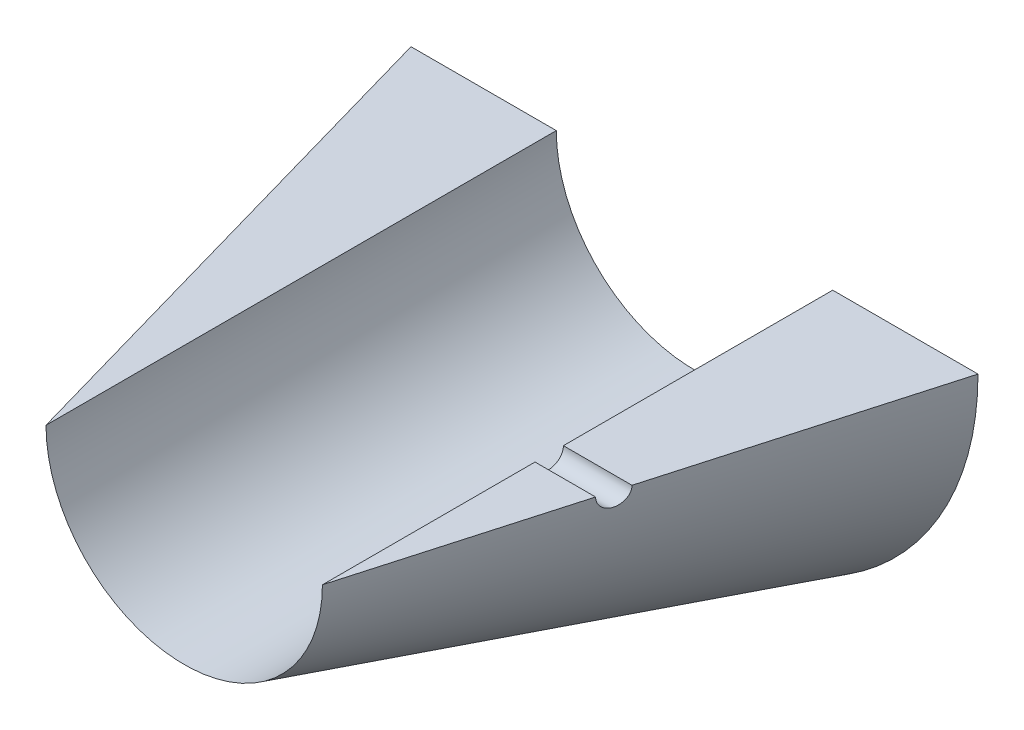
ISO-10303-21;
HEADER;
FILE_DESCRIPTION(('STEP AP214'),'2;1');
FILE_NAME('part.step','',(''),(''),'','','');
FILE_SCHEMA(('AUTOMOTIVE_DESIGN { 1 0 10303 214 1 1 1 1 }'));
ENDSEC;
DATA;
#1=APPLICATION_CONTEXT('core data for automotive mechanical design processes');
#2=APPLICATION_PROTOCOL_DEFINITION('international standard','automotive_design',2000,#1);
#3=PRODUCT_CONTEXT('',#1,'mechanical');
#4=PRODUCT('Part','Part','',(#3));
#5=PRODUCT_RELATED_PRODUCT_CATEGORY('part','',(#4));
#6=PRODUCT_DEFINITION_FORMATION('','',#4);
#7=PRODUCT_DEFINITION_CONTEXT('part definition',#1,'design');
#8=PRODUCT_DEFINITION('design','',#6,#7);
#9=PRODUCT_DEFINITION_SHAPE('','',#8);
#10=(LENGTH_UNIT() NAMED_UNIT(*) SI_UNIT(.MILLI.,.METRE.));
#11=(NAMED_UNIT(*) PLANE_ANGLE_UNIT() SI_UNIT($,.RADIAN.));
#12=(NAMED_UNIT(*) SI_UNIT($,.STERADIAN.) SOLID_ANGLE_UNIT());
#13=UNCERTAINTY_MEASURE_WITH_UNIT(LENGTH_MEASURE(1.E-05),#10,'distance_accuracy_value','');
#14=(GEOMETRIC_REPRESENTATION_CONTEXT(3) GLOBAL_UNCERTAINTY_ASSIGNED_CONTEXT((#13)) GLOBAL_UNIT_ASSIGNED_CONTEXT((#10,
#11,#12)) REPRESENTATION_CONTEXT('',''));
#15=CARTESIAN_POINT('',(0.,0.,0.));
#16=DIRECTION('',(0.,0.,1.));
#17=DIRECTION('',(1.,0.,0.));
#18=AXIS2_PLACEMENT_3D('',#15,#16,#17);
#19=CARTESIAN_POINT('',(0.,0.,180.));
#20=DIRECTION('',(0.,0.,1.));
#21=DIRECTION('',(1.,0.,0.));
#22=AXIS2_PLACEMENT_3D('',#19,#20,#21);
#23=CYLINDRICAL_SURFACE('',#22,48.75);
#24=DIRECTION('',(0.,0.,1.));
#25=VECTOR('',#24,1.);
#26=CARTESIAN_POINT('',(-48.75,0.,180.));
#27=LINE('',#26,#25);
#28=CARTESIAN_POINT('',(-48.75,0.,180.));
#29=VERTEX_POINT('',#28);
#30=CARTESIAN_POINT('',(-48.75,0.,0.));
#31=VERTEX_POINT('',#30);
#32=EDGE_CURVE('E49',#29,#31,#27,.F.);
#33=ORIENTED_EDGE('',*,*,#32,.F.);
#34=CARTESIAN_POINT('',(0.,0.,180.));
#35=DIRECTION('',(0.,0.,1.));
#36=DIRECTION('',(1.,0.,0.));
#37=AXIS2_PLACEMENT_3D('',#34,#35,#36);
#38=CIRCLE('',#37,48.75);
#39=CARTESIAN_POINT('',(48.75,0.,180.));
#40=VERTEX_POINT('',#39);
#41=EDGE_CURVE('E95',#29,#40,#38,.T.);
#42=ORIENTED_EDGE('',*,*,#41,.T.);
#43=DIRECTION('',(0.,0.,1.));
#44=VECTOR('',#43,1.);
#45=CARTESIAN_POINT('',(48.75,0.,180.));
#46=LINE('',#45,#44);
#47=CARTESIAN_POINT('',(48.75,0.,105.));
#48=VERTEX_POINT('',#47);
#49=EDGE_CURVE('E84',#48,#40,#46,.T.);
#50=ORIENTED_EDGE('',*,*,#49,.F.);
#51=CARTESIAN_POINT('',(48.75,0.,95.));
#52=CARTESIAN_POINT('',(48.750000389197,-0.14008100086284,94.9999986018309));
#53=CARTESIAN_POINT('',(48.7493950083053,-0.280140737873493,95.0058890159541));
#54=CARTESIAN_POINT('',(48.7469912287984,-0.559305925529234,95.0294068089419));
#55=CARTESIAN_POINT('',(48.7451925455075,-0.698411140459885,95.0470369884638));
#56=CARTESIAN_POINT('',(48.7404503592909,-0.974737830645201,95.0939279402502));
#57=CARTESIAN_POINT('',(48.737505949223,-1.11195772382351,95.1231979288691));
#58=CARTESIAN_POINT('',(48.7305544431504,-1.38347878134987,95.1931665631875));
#59=CARTESIAN_POINT('',(48.7265469582316,-1.51777885802131,95.2338693917857));
#60=CARTESIAN_POINT('',(48.7175873522136,-1.7823254585363,95.3263577551216));
#61=CARTESIAN_POINT('',(48.7126361631751,-1.91257583570178,95.3781323607879));
#62=CARTESIAN_POINT('',(48.701923936988,-2.16829177987035,95.4924361395613));
#63=CARTESIAN_POINT('',(48.696162601784,-2.2937555641763,95.5549692726647));
#64=CARTESIAN_POINT('',(48.6839968800058,-2.5388978794622,95.6902913994103));
#65=CARTESIAN_POINT('',(48.6775928619544,-2.65857966824321,95.7630745251197));
#66=CARTESIAN_POINT('',(48.6643161559048,-2.89144274282538,95.9184369559612));
#67=CARTESIAN_POINT('',(48.6574432951223,-3.00462160346189,96.0010198810297));
#68=CARTESIAN_POINT('',(48.6434027571373,-3.22397034323184,96.1756405164407));
#69=CARTESIAN_POINT('',(48.6362342596262,-3.33011824606443,96.2677057671708));
#70=CARTESIAN_POINT('',(48.6218213751467,-3.53432740876358,96.4604728753795));
#71=CARTESIAN_POINT('',(48.614576961105,-3.63238566486568,96.5611779128343));
#72=CARTESIAN_POINT('',(48.600221908122,-3.8196530425597,96.7704550377934));
#73=CARTESIAN_POINT('',(48.5931112269238,-3.90886499881192,96.8790245858134));
#74=CARTESIAN_POINT('',(48.5792198977998,-4.07787800390798,97.1033399806117));
#75=CARTESIAN_POINT('',(48.5724393726231,-4.15767556801212,97.219088460637));
#76=CARTESIAN_POINT('',(48.5593915128267,-4.30739554051586,97.4571373901257));
#77=CARTESIAN_POINT('',(48.55312516295,-4.37729917752714,97.5794497025295));
#78=CARTESIAN_POINT('',(48.5412967585839,-4.50657563732373,97.8296061375659));
#79=CARTESIAN_POINT('',(48.5357349658752,-4.56594454916064,97.9574522927828));
#80=CARTESIAN_POINT('',(48.5254804614672,-4.67366907148744,98.217689519941));
#81=CARTESIAN_POINT('',(48.5207874115692,-4.7220289694427,98.3500787993653));
#82=CARTESIAN_POINT('',(48.5124001208882,-4.80742627588238,98.6185052355794));
#83=CARTESIAN_POINT('',(48.5087062478272,-4.84445951652841,98.7545437151754));
#84=CARTESIAN_POINT('',(48.4993223283529,-4.93785036616057,99.1656124433031));
#85=CARTESIAN_POINT('',(48.4952805494567,-4.97700104155831,99.4448123428154));
#86=CARTESIAN_POINT('',(48.4920997750474,-5.00789044245951,100.005695122123));
#87=CARTESIAN_POINT('',(48.4929606443874,-4.99963047488887,100.287377933261));
#88=CARTESIAN_POINT('',(48.4994651170514,-4.9361304439657,100.84428299938));
#89=CARTESIAN_POINT('',(48.5050904528067,-4.88106981740609,101.119525809727));
#90=CARTESIAN_POINT('',(48.5204637315776,-4.72579415216424,101.65683235715));
#91=CARTESIAN_POINT('',(48.5302117328848,-4.62557847502081,101.918895907822));
#92=CARTESIAN_POINT('',(48.5527523909515,-4.38264425232442,102.422984278809));
#93=CARTESIAN_POINT('',(48.5655507320491,-4.23984622785899,102.664970536143));
#94=CARTESIAN_POINT('',(48.5927454108909,-3.91585672545949,103.12160957111));
#95=CARTESIAN_POINT('',(48.6071417978411,-3.73466406514936,103.336261506646));
#96=CARTESIAN_POINT('',(48.6359918294384,-3.3380272417351,103.733182554229));
#97=CARTESIAN_POINT('',(48.6504454299169,-3.12242809707303,103.915296835475));
#98=CARTESIAN_POINT('',(48.6777183357708,-2.66363602583515,104.24077219106));
#99=CARTESIAN_POINT('',(48.6905376391663,-2.42044306583126,104.384133218452));
#100=CARTESIAN_POINT('',(48.7131020876591,-1.91325834758283,104.628027014304));
#101=CARTESIAN_POINT('',(48.7228466565943,-1.64926270277589,104.728551757082));
#102=CARTESIAN_POINT('',(48.7381578744169,-1.10801780887595,104.883805091289));
#103=CARTESIAN_POINT('',(48.7437246547517,-0.830768977065377,104.938535123583));
#104=CARTESIAN_POINT('',(48.7500361632012,-0.272228441535443,105.00044864221));
#105=CARTESIAN_POINT('',(48.7508025560036,0.00903934777978221,105.007845750611));
#106=CARTESIAN_POINT('',(48.7474850668982,0.568810634624786,104.975444758929));
#107=CARTESIAN_POINT('',(48.7434012539818,0.847314171417597,104.93564733016));
#108=CARTESIAN_POINT('',(48.7308560801636,1.39303341447142,104.81016423428));
#109=CARTESIAN_POINT('',(48.7224042785875,1.66027239745354,104.724578759789));
#110=CARTESIAN_POINT('',(48.7020711161284,2.17660055900645,104.510052035007));
#111=CARTESIAN_POINT('',(48.6901896745848,2.42568931053593,104.381109765012));
#112=CARTESIAN_POINT('',(48.6642718407333,2.8996110877734,104.083001330848));
#113=CARTESIAN_POINT('',(48.6502280017268,3.12435554042963,103.913695015106));
#114=CARTESIAN_POINT('',(48.621584691777,3.54231194552546,103.539864177106));
#115=CARTESIAN_POINT('',(48.606985206158,3.73552306438865,103.335338724132));
#116=CARTESIAN_POINT('',(48.5788106240481,4.08567185517549,102.895946149536));
#117=CARTESIAN_POINT('',(48.5652396221104,4.24246919531283,102.660966909692));
#118=CARTESIAN_POINT('',(48.5407216552142,4.51437295777038,102.167875136452));
#119=CARTESIAN_POINT('',(48.5297746527683,4.62947997570706,101.909762933614));
#120=CARTESIAN_POINT('',(48.511768592767,4.8145067034086,101.378263175584));
#121=CARTESIAN_POINT('',(48.5047023901735,4.88450949714478,101.104904720184));
#122=CARTESIAN_POINT('',(48.4952408395981,4.97759035860086,100.550083631075));
#123=CARTESIAN_POINT('',(48.4928453500628,5.00066984840871,100.268621243232));
#124=CARTESIAN_POINT('',(48.4929473956605,4.99964290141229,99.8474570227359));
#125=CARTESIAN_POINT('',(48.4935928392565,4.99340252271699,99.7074908372863));
#126=CARTESIAN_POINT('',(48.4960784705341,4.96921054801502,99.4285989653847));
#127=CARTESIAN_POINT('',(48.4979182145855,4.95126330058479,99.2896729119443));
#128=CARTESIAN_POINT('',(48.5027427204151,4.90377491789048,99.0137948239799));
#129=CARTESIAN_POINT('',(48.5057279015383,4.87422953645153,98.8768435314916));
#130=CARTESIAN_POINT('',(48.5127559314431,4.80377618536093,98.6059744620394));
#131=CARTESIAN_POINT('',(48.5167983936194,4.76287236869493,98.4720555956482));
#132=CARTESIAN_POINT('',(48.525827445254,4.66998352416419,98.2081206581476));
#133=CARTESIAN_POINT('',(48.5308142285033,4.6179962215002,98.0781053944811));
#134=CARTESIAN_POINT('',(48.5415877348515,4.50334014269483,97.8229651191824));
#135=CARTESIAN_POINT('',(48.5473741657096,4.4406752668614,97.6978383423255));
#136=CARTESIAN_POINT('',(48.5595869146512,4.30507283476307,97.453255580476));
#137=CARTESIAN_POINT('',(48.5660134594491,4.23213163503253,97.3338016269521));
#138=CARTESIAN_POINT('',(48.5793210747985,4.0765372254649,97.1014861820133));
#139=CARTESIAN_POINT('',(48.5862019798918,3.99388754258636,96.9886223186799));
#140=CARTESIAN_POINT('',(48.6002611013155,3.8190116579077,96.7696946920308));
#141=CARTESIAN_POINT('',(48.6074405953638,3.72674104488739,96.6636664823935));
#142=CARTESIAN_POINT('',(48.6218597096454,3.5336420168319,96.4597909416014));
#143=CARTESIAN_POINT('',(48.6290993069958,3.4328167350974,96.3619406409847));
#144=CARTESIAN_POINT('',(48.6434412404114,3.22322228659948,96.1750073996124));
#145=CARTESIAN_POINT('',(48.650543490368,3.1144483284338,96.0859298242102));
#146=CARTESIAN_POINT('',(48.6644030484974,2.88981516863571,95.9172695742775));
#147=CARTESIAN_POINT('',(48.6711604830766,2.77395859816484,95.8376834057625));
#148=CARTESIAN_POINT('',(48.6841620584364,2.53557744063651,95.6883076711548));
#149=CARTESIAN_POINT('',(48.6904045927547,2.41303383009732,95.6185483180658));
#150=CARTESIAN_POINT('',(48.7021740092982,2.16251348650119,95.4896370889704));
#151=CARTESIAN_POINT('',(48.7077011534379,2.03453876476771,95.4304813277677));
#152=CARTESIAN_POINT('',(48.7178810869501,1.77412573229979,95.3232180732733));
#153=CARTESIAN_POINT('',(48.7225345887302,1.64169116318527,95.275101570895));
#154=CARTESIAN_POINT('',(48.7308395507551,1.37324976919271,95.1902179849387));
#155=CARTESIAN_POINT('',(48.734491256199,1.23724382738741,95.1534481238882));
#156=CARTESIAN_POINT('',(48.7416578208933,0.919647422003384,95.0818324431433));
#157=CARTESIAN_POINT('',(48.7447736658721,0.737087728326719,95.0511749660776));
#158=CARTESIAN_POINT('',(48.7489444941515,0.36967301153783,95.0102597116689));
#159=CARTESIAN_POINT('',(48.749999486507,0.184817998514194,95.0000018446957));
#160=CARTESIAN_POINT('',(48.75,0.,95.));
#161=B_SPLINE_CURVE_WITH_KNOTS('',3,(#51,#52,#53,#54,#55,#56,#57,#58,#59,#60,#61,#62,#63,#64,
#65,#66,#67,#68,#69,#70,#71,#72,#73,#74,#75,#76,#77,#78,#79,#80,#81,#82,#83,#84,#85,#86,#87,#88,
#89,#90,#91,#92,#93,#94,#95,#96,#97,#98,#99,#100,#101,#102,#103,#104,#105,#106,#107,#108,#109,
#110,#111,#112,#113,#114,#115,#116,#117,#118,#119,#120,#121,#122,#123,#124,#125,#126,#127,#128,
#129,#130,#131,#132,#133,#134,#135,#136,#137,#138,#139,#140,#141,#142,#143,#144,#145,#146,#147,
#148,#149,#150,#151,#152,#153,#154,#155,#156,#157,#158,#159,#160),.UNSPECIFIED.,.T.,.F.,(4,2,2,
2,2,2,2,2,2,2,2,2,2,2,2,2,2,2,2,2,2,2,2,2,2,2,2,2,2,2,2,2,2,2,2,2,2,2,2,2,2,2,2,2,2,2,2,2,2,2,2,
2,2,2,4),(0.,0.420081372263408,0.840262995736704,1.26077798189679,1.68144702145216,
2.1017027151597,2.52211342872985,2.9422844359281,3.36261113558632,3.78419502857095,
4.20593476173172,4.62753891521351,5.04929863919035,5.47184812352873,5.89455414991491,
6.31709527054133,6.7397916859001,7.58128440501172,8.42275392757352,9.26101167859738,
10.0992812823782,10.939125394758,11.7789953741871,12.62276120516,13.4665280583104,
14.3104529277644,15.1543512433517,15.9944381904937,16.8345131880398,17.6727574216204,
18.5110213711709,19.352239444942,20.1934797525183,21.0379101468124,21.8823284765202,
22.7251868695829,23.5680197180541,23.9879313067028,24.4076870057928,24.8275965245294,
25.2473527134102,25.6671951370627,26.086884528002,26.5067230958436,26.92640961108,
27.3481272649718,27.7696911185456,28.1915112178113,28.6131755538511,29.0361092707313,
29.458887704913,29.8813198745028,30.3036485574235,30.8578917387347,31.4121324848502),.UNSPECIFIED.);
#162=CARTESIAN_POINT('',(48.75,0.,95.));
#163=VERTEX_POINT('',#162);
#164=EDGE_CURVE('E94',#163,#48,#161,.T.);
#165=ORIENTED_EDGE('',*,*,#164,.F.);
#166=CARTESIAN_POINT('',(48.75,0.,0.));
#167=VERTEX_POINT('',#166);
#168=EDGE_CURVE('E98',#167,#163,#46,.T.);
#169=ORIENTED_EDGE('',*,*,#168,.F.);
#170=CARTESIAN_POINT('',(0.,0.,0.));
#171=DIRECTION('',(0.,0.,1.));
#172=DIRECTION('',(1.,0.,0.));
#173=AXIS2_PLACEMENT_3D('',#170,#171,#172);
#174=CIRCLE('',#173,48.75);
#175=EDGE_CURVE('E91',#31,#167,#174,.T.);
#176=ORIENTED_EDGE('',*,*,#175,.F.);
#177=EDGE_LOOP('',(#33,#42,#50,#165,#169,#176));
#178=FACE_BOUND('',#177,.T.);
#179=ADVANCED_FACE('F34',(#178),#23,.F.);
#180=CARTESIAN_POINT('',(0.,0.,0.));
#181=DIRECTION('',(0.,0.,-1.));
#182=DIRECTION('',(-1.,0.,0.));
#183=AXIS2_PLACEMENT_3D('',#180,#181,#182);
#184=CONICAL_SURFACE('',#183,100.,0.277382228069845);
#185=DIRECTION('',(0.273838880592993,0.,-0.961775580619292));
#186=VECTOR('',#185,1.);
#187=CARTESIAN_POINT('',(0.,0.,351.219512195122));
#188=LINE('',#187,#186);
#189=CARTESIAN_POINT('',(70.1041666666667,0.,105.));
#190=VERTEX_POINT('',#189);
#191=EDGE_CURVE('E86',#40,#190,#188,.T.);
#192=ORIENTED_EDGE('',*,*,#191,.F.);
#193=ORIENTED_EDGE('',*,*,#41,.F.);
#194=DIRECTION('',(0.273838880592993,0.,0.961775580619292));
#195=VECTOR('',#194,1.);
#196=CARTESIAN_POINT('',(0.,0.,351.219512195122));
#197=LINE('',#196,#195);
#198=CARTESIAN_POINT('',(-100.,0.,0.));
#199=VERTEX_POINT('',#198);
#200=EDGE_CURVE('E176',#199,#29,#197,.T.);
#201=ORIENTED_EDGE('',*,*,#200,.F.);
#202=CARTESIAN_POINT('',(0.,0.,0.));
#203=DIRECTION('',(0.,0.,1.));
#204=DIRECTION('',(1.,0.,0.));
#205=AXIS2_PLACEMENT_3D('',#202,#203,#204);
#206=CIRCLE('',#205,100.);
#207=CARTESIAN_POINT('',(100.,0.,0.));
#208=VERTEX_POINT('',#207);
#209=EDGE_CURVE('E102',#199,#208,#206,.T.);
#210=ORIENTED_EDGE('',*,*,#209,.T.);
#211=CARTESIAN_POINT('',(72.9513888888889,0.,95.));
#212=VERTEX_POINT('',#211);
#213=EDGE_CURVE('E96',#212,#208,#188,.T.);
#214=ORIENTED_EDGE('',*,*,#213,.F.);
#215=CARTESIAN_POINT('',(72.3344104427794,-3.8482549831851,96.8076758302407));
#216=CARTESIAN_POINT('',(72.297342251452,-3.94164834775744,96.9202568766703));
#217=CARTESIAN_POINT('',(72.2592485186354,-4.02992428732077,97.0367301921056));
#218=CARTESIAN_POINT('',(72.1813937055541,-4.19576304657064,97.276612803554));
#219=CARTESIAN_POINT('',(72.1416320206225,-4.27332193658131,97.4000246205307));
#220=CARTESIAN_POINT('',(72.0607983532004,-4.41732391511411,97.6529889511765));
#221=CARTESIAN_POINT('',(72.0197247208557,-4.48375229382683,97.7825493050856));
#222=CARTESIAN_POINT('',(71.9366874751427,-4.60500455194623,98.0467794058756));
#223=CARTESIAN_POINT('',(71.8947235293899,-4.65982401038557,98.1814510763332));
#224=CARTESIAN_POINT('',(71.8103686893135,-4.75741279563863,98.4546745202502));
#225=CARTESIAN_POINT('',(71.7679786631524,-4.80020288690188,98.5932191480942));
#226=CARTESIAN_POINT('',(71.6830425703146,-4.87360389722578,98.8735097834928));
#227=CARTESIAN_POINT('',(71.6404964522715,-4.90421035942921,99.0152569425555));
#228=CARTESIAN_POINT('',(71.5556370878055,-4.95299191296492,99.3008299442789));
#229=CARTESIAN_POINT('',(71.5133236962707,-4.9711759029638,99.4446542234488));
#230=CARTESIAN_POINT('',(71.4292093060449,-4.99499909619713,99.7335453817654));
#231=CARTESIAN_POINT('',(71.387408501737,-5.00063367835389,99.8786126989048));
#232=CARTESIAN_POINT('',(71.3042269420228,-4.99924637095836,100.170388479454));
#233=CARTESIAN_POINT('',(71.2628546359705,-4.992096655218,100.317098778275));
#234=CARTESIAN_POINT('',(71.1812464410978,-4.96486342249668,100.609694625701));
#235=CARTESIAN_POINT('',(71.1410109865828,-4.94477503053317,100.755579842526));
#236=CARTESIAN_POINT('',(71.0619837935183,-4.89172362367754,101.045334988883));
#237=CARTESIAN_POINT('',(71.0231915682464,-4.8587649931224,101.189205587439));
#238=CARTESIAN_POINT('',(70.947277692855,-4.78009873162702,101.473932805163));
#239=CARTESIAN_POINT('',(70.9101566502287,-4.73438650738603,101.61478831871));
#240=CARTESIAN_POINT('',(70.8384761022673,-4.63137776491862,101.889846695489));
#241=CARTESIAN_POINT('',(70.8038827712761,-4.57430184242394,102.024123336298));
#242=CARTESIAN_POINT('',(70.7367302857903,-4.44837775500767,102.287634180933));
#243=CARTESIAN_POINT('',(70.704171893865,-4.37952521262545,102.416866487723));
#244=CARTESIAN_POINT('',(70.6412911699547,-4.23050637862678,102.669129581625));
#245=CARTESIAN_POINT('',(70.6109676873387,-4.15034597163186,102.792163549445));
#246=CARTESIAN_POINT('',(70.5526844415869,-3.97921673684608,103.03108384329));
#247=CARTESIAN_POINT('',(70.5247255285609,-3.88824404986076,103.146967594655));
#248=CARTESIAN_POINT('',(70.4463246807372,-3.60618889102909,103.475137337748));
#249=CARTESIAN_POINT('',(70.3992715685781,-3.40095937748356,103.676379857686));
#250=CARTESIAN_POINT('',(70.3152489826932,-2.95793863259964,104.041418796466));
#251=CARTESIAN_POINT('',(70.2782778142858,-2.72015288376901,104.205221507845));
#252=CARTESIAN_POINT('',(70.2156906935521,-2.22606132138278,104.485867905413));
#253=CARTESIAN_POINT('',(70.1897795202408,-1.97048212587851,104.603923494281));
#254=CARTESIAN_POINT('',(70.1480137800488,-1.44242448422665,104.79565460646));
#255=CARTESIAN_POINT('',(70.1321581387436,-1.16994784697188,104.869334871193));
#256=CARTESIAN_POINT('',(70.1107724199298,-0.620951937919615,104.968993329965));
#257=CARTESIAN_POINT('',(70.1050667858289,-0.344586462373336,104.99578242953));
#258=CARTESIAN_POINT('',(70.1034633176426,0.208791351094806,105.003295512395));
#259=CARTESIAN_POINT('',(70.1075649725617,0.485803654563269,104.984021895731));
#260=CARTESIAN_POINT('',(70.1255044005828,1.03086087074179,104.900295553295));
#261=CARTESIAN_POINT('',(70.1392831859912,1.29894985896373,104.836116560533));
#262=CARTESIAN_POINT('',(70.1764456852173,1.82036799223322,104.66492844216));
#263=CARTESIAN_POINT('',(70.1998293738459,2.07369717598666,104.557919428872));
#264=CARTESIAN_POINT('',(70.2561653777087,2.55966339954795,104.303907197622));
#265=CARTESIAN_POINT('',(70.2891583118976,2.792207008001,104.156734374332));
#266=CARTESIAN_POINT('',(70.3643648313081,3.22914860438056,103.827204289685));
#267=CARTESIAN_POINT('',(70.4065788842213,3.43354516384165,103.644845243749));
#268=CARTESIAN_POINT('',(70.5004157936502,3.81182877766303,103.247510889298));
#269=CARTESIAN_POINT('',(70.5521704768207,3.98521133255176,103.03208672501));
#270=CARTESIAN_POINT('',(70.6638498019861,4.29345353044594,102.577165283322));
#271=CARTESIAN_POINT('',(70.7237753724772,4.42830879001568,102.337665270883));
#272=CARTESIAN_POINT('',(70.8523506862158,4.65953164181777,101.83500842853));
#273=CARTESIAN_POINT('',(70.9211859909914,4.75481352533009,101.571399938312));
#274=CARTESIAN_POINT('',(71.0648159578709,4.89994500487304,101.033525729819));
#275=CARTESIAN_POINT('',(71.1396116046294,4.94978707721087,100.75925825452));
#276=CARTESIAN_POINT('',(71.2958190777194,5.00423327379883,100.19863306801));
#277=CARTESIAN_POINT('',(71.3773656343697,5.00734915348368,99.912168157482));
#278=CARTESIAN_POINT('',(71.5426357939453,4.9649099906913,99.343488122812));
#279=CARTESIAN_POINT('',(71.6263597632022,4.91934670598766,99.0612737265612));
#280=CARTESIAN_POINT('',(71.7954661466697,4.77920742264671,98.5019057464639));
#281=CARTESIAN_POINT('',(71.8808399239317,4.68347711951628,98.2250378664362));
#282=CARTESIAN_POINT('',(72.0482373003637,4.44472929045425,97.6913549367887));
#283=CARTESIAN_POINT('',(72.1302606854711,4.30170874835853,97.4345411675088));
#284=CARTESIAN_POINT('',(72.2875963830451,3.97210775773648,96.9490577729941));
#285=CARTESIAN_POINT('',(72.3629227095252,3.78562137653766,96.7203289765303));
#286=CARTESIAN_POINT('',(72.5037551994354,3.37347508582064,96.2977416438105));
#287=CARTESIAN_POINT('',(72.5692632397583,3.14782268124088,96.1038764415058));
#288=CARTESIAN_POINT('',(72.6850324786803,2.67234662196699,95.7643495157037));
#289=CARTESIAN_POINT('',(72.7357667381791,2.42372076071589,95.6171741957666));
#290=CARTESIAN_POINT('',(72.8224607644825,1.90272003148597,95.3671777334845));
#291=CARTESIAN_POINT('',(72.8584261098979,1.63035417794592,95.2643398429817));
#292=CARTESIAN_POINT('',(72.9120414557822,1.08552523628,95.1115111935793));
#293=CARTESIAN_POINT('',(72.930578019778,0.81386655563779,95.0589595945602));
#294=CARTESIAN_POINT('',(72.9515909053043,0.265023056148882,94.9994108992838));
#295=CARTESIAN_POINT('',(72.9540719831561,-0.0121601017015707,94.9924003118296));
#296=CARTESIAN_POINT('',(72.9430509861399,-0.553556804829854,95.0236094834158));
#297=CARTESIAN_POINT('',(72.9301219187618,-0.817877659292037,95.0602076883691));
#298=CARTESIAN_POINT('',(72.8898928438587,-1.33636548708416,95.1745869136293));
#299=CARTESIAN_POINT('',(72.8625893136336,-1.59052995498896,95.2523780289684));
#300=CARTESIAN_POINT('',(72.7947522728482,-2.08333789019387,95.4469392920846));
#301=CARTESIAN_POINT('',(72.7541385957174,-2.32187652895016,95.5639457317503));
#302=CARTESIAN_POINT('',(72.6616149772138,-2.77568928984393,95.8328674808929));
#303=CARTESIAN_POINT('',(72.6097163611319,-2.99098641475167,95.984747800284));
#304=CARTESIAN_POINT('',(72.5197171840105,-3.31197336959616,96.2509866205535));
#305=CARTESIAN_POINT('',(72.484543458109,-3.42673458962763,96.3556220919958));
#306=CARTESIAN_POINT('',(72.4114298764104,-3.64564464849038,96.5746217655433));
#307=CARTESIAN_POINT('',(72.373490089851,-3.7497937527985,96.6889857241456));
#308=CARTESIAN_POINT('',(72.3344104427794,-3.8482549831851,96.8076758302407));
#309=B_SPLINE_CURVE_WITH_KNOTS('',3,(#215,#216,#217,#218,#219,#220,#221,#222,#223,#224,#225,
#226,#227,#228,#229,#230,#231,#232,#233,#234,#235,#236,#237,#238,#239,#240,#241,#242,#243,#244,
#245,#246,#247,#248,#249,#250,#251,#252,#253,#254,#255,#256,#257,#258,#259,#260,#261,#262,#263,
#264,#265,#266,#267,#268,#269,#270,#271,#272,#273,#274,#275,#276,#277,#278,#279,#280,#281,#282,
#283,#284,#285,#286,#287,#288,#289,#290,#291,#292,#293,#294,#295,#296,#297,#298,#299,#300,#301,
#302,#303,#304,#305,#306,#307,#308),.UNSPECIFIED.,.T.,.F.,(4,2,2,2,2,2,2,2,2,2,2,2,2,2,2,2,2,2,
2,2,2,2,2,2,2,2,2,2,2,2,2,2,2,2,2,2,2,2,2,2,2,2,2,2,2,2,4),(0.,0.452544553034413,
0.905254605063821,1.3585583076147,1.81203433034364,2.26472271223476,2.71757653888203,
3.17010562882543,3.62280132635735,4.08004872639717,4.53746850713826,4.99473260036979,
5.4521615937023,5.9014514034823,6.3509085821425,6.80013271993697,7.24951768220831,
8.1185955546342,8.98752725293938,9.83154140186433,10.6754653534424,11.504645249808,
12.3337819438143,13.1579079489118,13.9820317927357,14.809691119259,15.6373924341043,
16.4775288660685,17.3177608463641,18.1797255612834,19.0418329700292,19.9313424917245,
20.8210026466742,21.7320952823478,22.6432460385807,23.5524429274398,24.4614657892172,
25.3369763577453,26.212155917824,27.0399295745708,27.8674579981418,28.6651519668998,
29.4630415148386,30.2658278661165,31.0678122486272,31.5449254641643,32.0220267411186),.UNSPECIFIED.);
#310=EDGE_CURVE('E100',#212,#190,#309,.T.);
#311=ORIENTED_EDGE('',*,*,#310,.T.);
#312=EDGE_LOOP('',(#192,#193,#201,#210,#214,#311));
#313=FACE_BOUND('',#312,.T.);
#314=ADVANCED_FACE('F121',(#313),#184,.T.);
#315=CARTESIAN_POINT('',(0.,48.75,0.));
#316=DIRECTION('',(0.,0.,1.));
#317=DIRECTION('',(1.,0.,0.));
#318=AXIS2_PLACEMENT_3D('',#315,#316,#317);
#319=PLANE('',#318);
#320=DIRECTION('',(-1.,0.,0.));
#321=VECTOR('',#320,1.);
#322=CARTESIAN_POINT('',(0.,0.,0.));
#323=LINE('',#322,#321);
#324=EDGE_CURVE('E179',#208,#167,#323,.T.);
#325=ORIENTED_EDGE('',*,*,#324,.F.);
#326=ORIENTED_EDGE('',*,*,#209,.F.);
#327=EDGE_CURVE('E57',#31,#199,#323,.T.);
#328=ORIENTED_EDGE('',*,*,#327,.F.);
#329=ORIENTED_EDGE('',*,*,#175,.T.);
#330=EDGE_LOOP('',(#325,#326,#328,#329));
#331=FACE_BOUND('',#330,.T.);
#332=ADVANCED_FACE('F116',(#331),#319,.F.);
#333=CARTESIAN_POINT('',(100.001,0.,100.));
#334=DIRECTION('',(-1.,0.,0.));
#335=DIRECTION('',(0.,0.,1.));
#336=AXIS2_PLACEMENT_3D('',#333,#334,#335);
#337=CYLINDRICAL_SURFACE('',#336,5.);
#338=ORIENTED_EDGE('',*,*,#310,.F.);
#339=DIRECTION('',(-1.,0.,0.));
#340=VECTOR('',#339,1.);
#341=CARTESIAN_POINT('',(100.001,0.,95.));
#342=LINE('',#341,#340);
#343=EDGE_CURVE('E12',#212,#163,#342,.T.);
#344=ORIENTED_EDGE('',*,*,#343,.T.);
#345=ORIENTED_EDGE('',*,*,#164,.T.);
#346=DIRECTION('',(-1.,0.,0.));
#347=VECTOR('',#346,1.);
#348=CARTESIAN_POINT('',(100.001,0.,105.));
#349=LINE('',#348,#347);
#350=EDGE_CURVE('E42',#48,#190,#349,.F.);
#351=ORIENTED_EDGE('',*,*,#350,.T.);
#352=EDGE_LOOP('',(#338,#344,#345,#351));
#353=FACE_BOUND('',#352,.T.);
#354=ADVANCED_FACE('F99',(#353),#337,.F.);
#355=CARTESIAN_POINT('',(0.,0.,0.));
#356=DIRECTION('',(0.,1.,0.));
#357=DIRECTION('',(0.,0.,1.));
#358=AXIS2_PLACEMENT_3D('',#355,#356,#357);
#359=PLANE('',#358);
#360=ORIENTED_EDGE('',*,*,#350,.F.);
#361=ORIENTED_EDGE('',*,*,#49,.T.);
#362=ORIENTED_EDGE('',*,*,#191,.T.);
#363=EDGE_LOOP('',(#360,#361,#362));
#364=FACE_BOUND('',#363,.T.);
#365=ADVANCED_FACE('F83',(#364),#359,.T.);
#366=ORIENTED_EDGE('',*,*,#213,.T.);
#367=ORIENTED_EDGE('',*,*,#324,.T.);
#368=ORIENTED_EDGE('',*,*,#168,.T.);
#369=ORIENTED_EDGE('',*,*,#343,.F.);
#370=EDGE_LOOP('',(#366,#367,#368,#369));
#371=FACE_BOUND('',#370,.T.);
#372=ADVANCED_FACE('F155',(#371),#359,.T.);
#373=ORIENTED_EDGE('',*,*,#200,.T.);
#374=ORIENTED_EDGE('',*,*,#32,.T.);
#375=ORIENTED_EDGE('',*,*,#327,.T.);
#376=EDGE_LOOP('',(#373,#374,#375));
#377=FACE_BOUND('',#376,.T.);
#378=ADVANCED_FACE('F117',(#377),#359,.T.);
#379=CLOSED_SHELL('',(#179,#314,#332,#354,#365,#372,#378));
#380=MANIFOLD_SOLID_BREP('B2',#379);
#381=ADVANCED_BREP_SHAPE_REPRESENTATION('',(#18,#380),#14);
#382=SHAPE_DEFINITION_REPRESENTATION(#9,#381);
ENDSEC;
END-ISO-10303-21;
